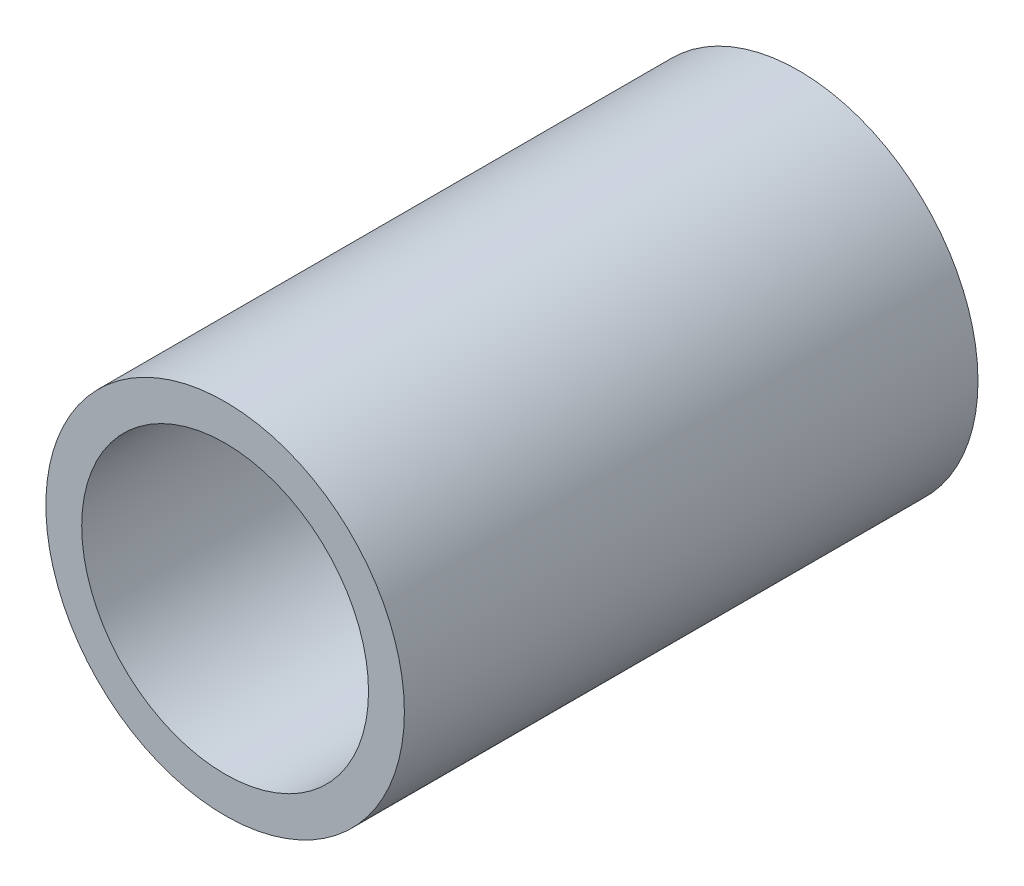
ISO-10303-21;
HEADER;
FILE_DESCRIPTION(('STEP AP214'),'2;1');
FILE_NAME('part.step','',(''),(''),'','','');
FILE_SCHEMA(('AUTOMOTIVE_DESIGN { 1 0 10303 214 1 1 1 1 }'));
ENDSEC;
DATA;
#1=APPLICATION_CONTEXT('core data for automotive mechanical design processes');
#2=APPLICATION_PROTOCOL_DEFINITION('international standard','automotive_design',2000,#1);
#3=PRODUCT_CONTEXT('',#1,'mechanical');
#4=PRODUCT('Part','Part','',(#3));
#5=PRODUCT_RELATED_PRODUCT_CATEGORY('part','',(#4));
#6=PRODUCT_DEFINITION_FORMATION('','',#4);
#7=PRODUCT_DEFINITION_CONTEXT('part definition',#1,'design');
#8=PRODUCT_DEFINITION('design','',#6,#7);
#9=PRODUCT_DEFINITION_SHAPE('','',#8);
#10=(LENGTH_UNIT() NAMED_UNIT(*) SI_UNIT(.MILLI.,.METRE.));
#11=(NAMED_UNIT(*) PLANE_ANGLE_UNIT() SI_UNIT($,.RADIAN.));
#12=(NAMED_UNIT(*) SI_UNIT($,.STERADIAN.) SOLID_ANGLE_UNIT());
#13=UNCERTAINTY_MEASURE_WITH_UNIT(LENGTH_MEASURE(1.E-05),#10,'distance_accuracy_value','');
#14=(GEOMETRIC_REPRESENTATION_CONTEXT(3) GLOBAL_UNCERTAINTY_ASSIGNED_CONTEXT((#13)) GLOBAL_UNIT_ASSIGNED_CONTEXT((#10,
#11,#12)) REPRESENTATION_CONTEXT('',''));
#15=CARTESIAN_POINT('',(0.,0.,0.));
#16=DIRECTION('',(0.,0.,1.));
#17=DIRECTION('',(1.,0.,0.));
#18=AXIS2_PLACEMENT_3D('',#15,#16,#17);
#19=CARTESIAN_POINT('',(0.,0.,6.35));
#20=DIRECTION('',(0.,0.,-1.));
#21=DIRECTION('',(-1.,0.,0.));
#22=AXIS2_PLACEMENT_3D('',#19,#20,#21);
#23=CYLINDRICAL_SURFACE('',#22,1.984375);
#24=CARTESIAN_POINT('',(0.,0.,6.35));
#25=DIRECTION('',(0.,0.,1.));
#26=DIRECTION('',(1.,0.,0.));
#27=AXIS2_PLACEMENT_3D('',#24,#25,#26);
#28=CIRCLE('',#27,1.984375);
#29=CARTESIAN_POINT('',(1.984375,0.,6.35));
#30=VERTEX_POINT('',#29);
#31=EDGE_CURVE('E10',#30,#30,#28,.T.);
#32=ORIENTED_EDGE('',*,*,#31,.F.);
#33=EDGE_LOOP('',(#32));
#34=FACE_BOUND('',#33,.T.);
#35=CARTESIAN_POINT('',(0.,0.,0.));
#36=DIRECTION('',(0.,0.,1.));
#37=DIRECTION('',(1.,0.,0.));
#38=AXIS2_PLACEMENT_3D('',#35,#36,#37);
#39=CIRCLE('',#38,1.984375);
#40=CARTESIAN_POINT('',(1.984375,0.,0.));
#41=VERTEX_POINT('',#40);
#42=EDGE_CURVE('E45',#41,#41,#39,.T.);
#43=ORIENTED_EDGE('',*,*,#42,.T.);
#44=EDGE_LOOP('',(#43));
#45=FACE_BOUND('',#44,.T.);
#46=ADVANCED_FACE('F39',(#34,#45),#23,.T.);
#47=CARTESIAN_POINT('',(0.,0.,6.35));
#48=DIRECTION('',(0.,0.,1.));
#49=DIRECTION('',(1.,0.,0.));
#50=AXIS2_PLACEMENT_3D('',#47,#48,#49);
#51=PLANE('',#50);
#52=CARTESIAN_POINT('',(0.,0.,6.35));
#53=DIRECTION('',(0.,0.,1.));
#54=DIRECTION('',(1.,0.,0.));
#55=AXIS2_PLACEMENT_3D('',#52,#53,#54);
#56=CIRCLE('',#55,1.5875);
#57=CARTESIAN_POINT('',(1.5875,0.,6.35));
#58=VERTEX_POINT('',#57);
#59=EDGE_CURVE('E51',#58,#58,#56,.T.);
#60=ORIENTED_EDGE('',*,*,#59,.F.);
#61=EDGE_LOOP('',(#60));
#62=FACE_BOUND('',#61,.T.);
#63=ORIENTED_EDGE('',*,*,#31,.T.);
#64=EDGE_LOOP('',(#63));
#65=FACE_BOUND('',#64,.T.);
#66=ADVANCED_FACE('F66',(#62,#65),#51,.T.);
#67=CARTESIAN_POINT('',(0.,0.,0.));
#68=DIRECTION('',(0.,0.,1.));
#69=DIRECTION('',(1.,0.,0.));
#70=AXIS2_PLACEMENT_3D('',#67,#68,#69);
#71=PLANE('',#70);
#72=CARTESIAN_POINT('',(0.,0.,0.));
#73=DIRECTION('',(0.,0.,1.));
#74=DIRECTION('',(1.,0.,0.));
#75=AXIS2_PLACEMENT_3D('',#72,#73,#74);
#76=CIRCLE('',#75,1.5875);
#77=CARTESIAN_POINT('',(1.5875,0.,0.));
#78=VERTEX_POINT('',#77);
#79=EDGE_CURVE('E47',#78,#78,#76,.T.);
#80=ORIENTED_EDGE('',*,*,#79,.T.);
#81=EDGE_LOOP('',(#80));
#82=FACE_BOUND('',#81,.T.);
#83=ORIENTED_EDGE('',*,*,#42,.F.);
#84=EDGE_LOOP('',(#83));
#85=FACE_BOUND('',#84,.T.);
#86=ADVANCED_FACE('F60',(#82,#85),#71,.F.);
#87=CARTESIAN_POINT('',(0.,0.,0.));
#88=DIRECTION('',(0.,0.,1.));
#89=DIRECTION('',(1.,0.,0.));
#90=AXIS2_PLACEMENT_3D('',#87,#88,#89);
#91=CYLINDRICAL_SURFACE('',#90,1.5875);
#92=ORIENTED_EDGE('',*,*,#79,.F.);
#93=EDGE_LOOP('',(#92));
#94=FACE_BOUND('',#93,.T.);
#95=ORIENTED_EDGE('',*,*,#59,.T.);
#96=EDGE_LOOP('',(#95));
#97=FACE_BOUND('',#96,.T.);
#98=ADVANCED_FACE('F58',(#94,#97),#91,.F.);
#99=CLOSED_SHELL('',(#46,#66,#86,#98));
#100=MANIFOLD_SOLID_BREP('B2',#99);
#101=ADVANCED_BREP_SHAPE_REPRESENTATION('',(#18,#100),#14);
#102=SHAPE_DEFINITION_REPRESENTATION(#9,#101);
ENDSEC;
END-ISO-10303-21;
